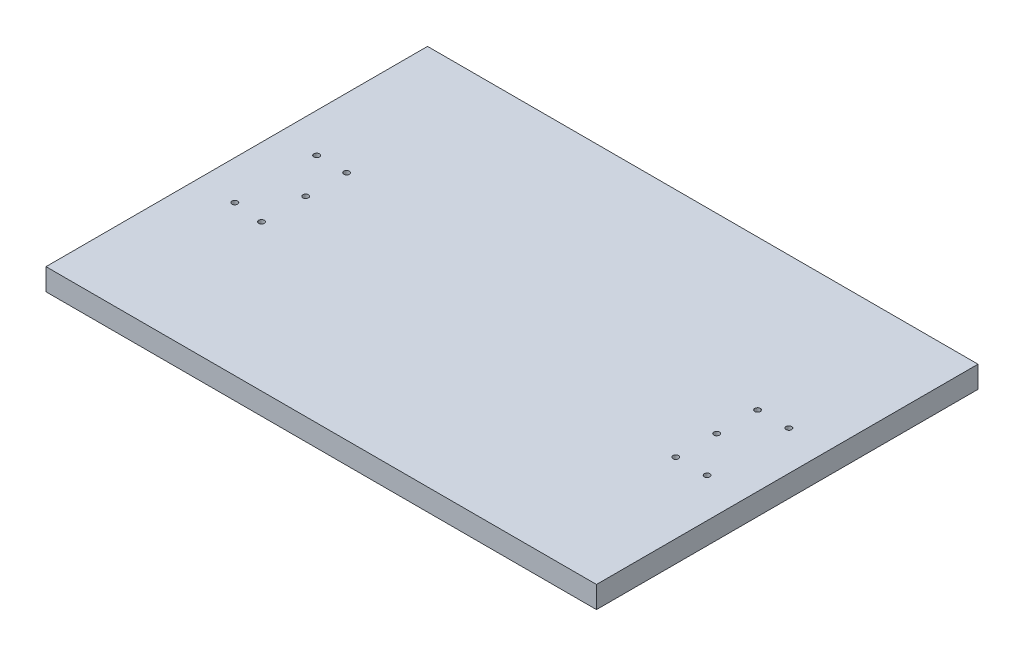
ISO-10303-21;
HEADER;
FILE_DESCRIPTION(('STEP AP214'),'2;1');
FILE_NAME('part.step','',(''),(''),'','','');
FILE_SCHEMA(('AUTOMOTIVE_DESIGN { 1 0 10303 214 1 1 1 1 }'));
ENDSEC;
DATA;
#1=APPLICATION_CONTEXT('core data for automotive mechanical design processes');
#2=APPLICATION_PROTOCOL_DEFINITION('international standard','automotive_design',2000,#1);
#3=PRODUCT_CONTEXT('',#1,'mechanical');
#4=PRODUCT('Part','Part','',(#3));
#5=PRODUCT_RELATED_PRODUCT_CATEGORY('part','',(#4));
#6=PRODUCT_DEFINITION_FORMATION('','',#4);
#7=PRODUCT_DEFINITION_CONTEXT('part definition',#1,'design');
#8=PRODUCT_DEFINITION('design','',#6,#7);
#9=PRODUCT_DEFINITION_SHAPE('','',#8);
#10=(LENGTH_UNIT() NAMED_UNIT(*) SI_UNIT(.MILLI.,.METRE.));
#11=(NAMED_UNIT(*) PLANE_ANGLE_UNIT() SI_UNIT($,.RADIAN.));
#12=(NAMED_UNIT(*) SI_UNIT($,.STERADIAN.) SOLID_ANGLE_UNIT());
#13=UNCERTAINTY_MEASURE_WITH_UNIT(LENGTH_MEASURE(1.E-05),#10,'distance_accuracy_value','');
#14=(GEOMETRIC_REPRESENTATION_CONTEXT(3) GLOBAL_UNCERTAINTY_ASSIGNED_CONTEXT((#13)) GLOBAL_UNIT_ASSIGNED_CONTEXT((#10,
#11,#12)) REPRESENTATION_CONTEXT('',''));
#15=CARTESIAN_POINT('',(0.,0.,0.));
#16=DIRECTION('',(0.,0.,1.));
#17=DIRECTION('',(1.,0.,0.));
#18=AXIS2_PLACEMENT_3D('',#15,#16,#17);
#19=CARTESIAN_POINT('',(505.,-20.,-350.));
#20=DIRECTION('',(0.,0.,1.));
#21=DIRECTION('',(1.,0.,0.));
#22=AXIS2_PLACEMENT_3D('',#19,#20,#21);
#23=PLANE('',#22);
#24=DIRECTION('',(0.,1.,0.));
#25=VECTOR('',#24,1.);
#26=CARTESIAN_POINT('',(-505.,-20.,-350.));
#27=LINE('',#26,#25);
#28=CARTESIAN_POINT('',(-505.,-20.,-350.));
#29=VERTEX_POINT('',#28);
#30=CARTESIAN_POINT('',(-505.,20.,-350.));
#31=VERTEX_POINT('',#30);
#32=EDGE_CURVE('E223',#29,#31,#27,.T.);
#33=ORIENTED_EDGE('',*,*,#32,.T.);
#34=DIRECTION('',(-1.,0.,0.));
#35=VECTOR('',#34,1.);
#36=CARTESIAN_POINT('',(505.,20.,-350.));
#37=LINE('',#36,#35);
#38=CARTESIAN_POINT('',(505.,20.,-350.));
#39=VERTEX_POINT('',#38);
#40=EDGE_CURVE('E11',#39,#31,#37,.T.);
#41=ORIENTED_EDGE('',*,*,#40,.F.);
#42=DIRECTION('',(0.,1.,0.));
#43=VECTOR('',#42,1.);
#44=CARTESIAN_POINT('',(505.,-20.,-350.));
#45=LINE('',#44,#43);
#46=CARTESIAN_POINT('',(505.,-20.,-350.));
#47=VERTEX_POINT('',#46);
#48=EDGE_CURVE('E224',#47,#39,#45,.T.);
#49=ORIENTED_EDGE('',*,*,#48,.F.);
#50=DIRECTION('',(-1.,0.,0.));
#51=VECTOR('',#50,1.);
#52=CARTESIAN_POINT('',(505.,-20.,-350.));
#53=LINE('',#52,#51);
#54=EDGE_CURVE('E234',#47,#29,#53,.T.);
#55=ORIENTED_EDGE('',*,*,#54,.T.);
#56=EDGE_LOOP('',(#33,#41,#49,#55));
#57=FACE_BOUND('',#56,.T.);
#58=ADVANCED_FACE('F55',(#57),#23,.F.);
#59=CARTESIAN_POINT('',(505.,20.,350.));
#60=DIRECTION('',(0.,-1.,0.));
#61=DIRECTION('',(0.,0.,-1.));
#62=AXIS2_PLACEMENT_3D('',#59,#60,#61);
#63=PLANE('',#62);
#64=CARTESIAN_POINT('',(-378.499999999998,20.,-75.0520137662989));
#65=DIRECTION('',(0.,1.,0.));
#66=DIRECTION('',(0.,0.,1.));
#67=AXIS2_PLACEMENT_3D('',#64,#65,#66);
#68=CIRCLE('',#67,5.09999999999999);
#69=CARTESIAN_POINT('',(-378.499999999998,20.,-69.9520137662989));
#70=VERTEX_POINT('',#69);
#71=EDGE_CURVE('E146',#70,#70,#68,.T.);
#72=ORIENTED_EDGE('',*,*,#71,.F.);
#73=EDGE_LOOP('',(#72));
#74=FACE_BOUND('',#73,.T.);
#75=CARTESIAN_POINT('',(-433.499999999998,20.,-74.9999999998687));
#76=DIRECTION('',(0.,1.,0.));
#77=DIRECTION('',(0.,0.,1.));
#78=AXIS2_PLACEMENT_3D('',#75,#76,#77);
#79=CIRCLE('',#78,5.09999999999999);
#80=CARTESIAN_POINT('',(-433.499999999998,20.,-69.8999999998688));
#81=VERTEX_POINT('',#80);
#82=EDGE_CURVE('E145',#81,#81,#79,.T.);
#83=ORIENTED_EDGE('',*,*,#82,.F.);
#84=EDGE_LOOP('',(#83));
#85=FACE_BOUND('',#84,.T.);
#86=CARTESIAN_POINT('',(-378.499999999997,20.,81.1309930747455));
#87=DIRECTION('',(0.,1.,0.));
#88=DIRECTION('',(0.,0.,1.));
#89=AXIS2_PLACEMENT_3D('',#86,#87,#88);
#90=CIRCLE('',#89,5.09999999999999);
#91=CARTESIAN_POINT('',(-378.499999999997,20.,86.2309930747455));
#92=VERTEX_POINT('',#91);
#93=EDGE_CURVE('E159',#92,#92,#90,.T.);
#94=ORIENTED_EDGE('',*,*,#93,.F.);
#95=EDGE_LOOP('',(#94));
#96=FACE_BOUND('',#95,.T.);
#97=CARTESIAN_POINT('',(-433.499999999997,20.,75.0000000001313));
#98=DIRECTION('',(0.,1.,0.));
#99=DIRECTION('',(0.,0.,1.));
#100=AXIS2_PLACEMENT_3D('',#97,#98,#99);
#101=CIRCLE('',#100,5.09999999999999);
#102=CARTESIAN_POINT('',(-433.499999999997,20.,80.1000000001312));
#103=VERTEX_POINT('',#102);
#104=EDGE_CURVE('E167',#103,#103,#101,.T.);
#105=ORIENTED_EDGE('',*,*,#104,.F.);
#106=EDGE_LOOP('',(#105));
#107=FACE_BOUND('',#106,.T.);
#108=CARTESIAN_POINT('',(433.000000000002,20.,-74.9999999998748));
#109=DIRECTION('',(0.,1.,0.));
#110=DIRECTION('',(0.,0.,1.));
#111=AXIS2_PLACEMENT_3D('',#108,#109,#110);
#112=CIRCLE('',#111,5.09999999999999);
#113=CARTESIAN_POINT('',(433.000000000002,20.,-69.8999999998748));
#114=VERTEX_POINT('',#113);
#115=EDGE_CURVE('E175',#114,#114,#112,.T.);
#116=ORIENTED_EDGE('',*,*,#115,.F.);
#117=EDGE_LOOP('',(#116));
#118=FACE_BOUND('',#117,.T.);
#119=CARTESIAN_POINT('',(375.500000000002,20.,-74.9999999998742));
#120=DIRECTION('',(0.,1.,0.));
#121=DIRECTION('',(0.,0.,1.));
#122=AXIS2_PLACEMENT_3D('',#119,#120,#121);
#123=CIRCLE('',#122,5.09999999999999);
#124=CARTESIAN_POINT('',(375.500000000002,20.,-69.8999999998742));
#125=VERTEX_POINT('',#124);
#126=EDGE_CURVE('E183',#125,#125,#123,.T.);
#127=ORIENTED_EDGE('',*,*,#126,.F.);
#128=EDGE_LOOP('',(#127));
#129=FACE_BOUND('',#128,.T.);
#130=CARTESIAN_POINT('',(433.000000000003,20.,75.0000000001252));
#131=DIRECTION('',(0.,1.,0.));
#132=DIRECTION('',(0.,0.,1.));
#133=AXIS2_PLACEMENT_3D('',#130,#131,#132);
#134=CIRCLE('',#133,5.09999999999999);
#135=CARTESIAN_POINT('',(433.000000000003,20.,80.1000000001252));
#136=VERTEX_POINT('',#135);
#137=EDGE_CURVE('E191',#136,#136,#134,.T.);
#138=ORIENTED_EDGE('',*,*,#137,.F.);
#139=EDGE_LOOP('',(#138));
#140=FACE_BOUND('',#139,.T.);
#141=CARTESIAN_POINT('',(375.500000000003,20.,75.0000000001258));
#142=DIRECTION('',(0.,1.,0.));
#143=DIRECTION('',(0.,0.,1.));
#144=AXIS2_PLACEMENT_3D('',#141,#142,#143);
#145=CIRCLE('',#144,5.09999999999999);
#146=CARTESIAN_POINT('',(375.500000000003,20.,80.1000000001258));
#147=VERTEX_POINT('',#146);
#148=EDGE_CURVE('E199',#147,#147,#145,.T.);
#149=ORIENTED_EDGE('',*,*,#148,.F.);
#150=EDGE_LOOP('',(#149));
#151=FACE_BOUND('',#150,.T.);
#152=CARTESIAN_POINT('',(375.500000000003,20.,1.25806608447687E-10));
#153=DIRECTION('',(0.,1.,0.));
#154=DIRECTION('',(0.,0.,1.));
#155=AXIS2_PLACEMENT_3D('',#152,#153,#154);
#156=CIRCLE('',#155,5.09999999999999);
#157=CARTESIAN_POINT('',(375.500000000003,20.,5.1000000001258));
#158=VERTEX_POINT('',#157);
#159=EDGE_CURVE('E207',#158,#158,#156,.T.);
#160=ORIENTED_EDGE('',*,*,#159,.F.);
#161=EDGE_LOOP('',(#160));
#162=FACE_BOUND('',#161,.T.);
#163=CARTESIAN_POINT('',(-378.499999999998,20.,1.31060166835473E-10));
#164=DIRECTION('',(0.,1.,0.));
#165=DIRECTION('',(0.,0.,1.));
#166=AXIS2_PLACEMENT_3D('',#163,#164,#165);
#167=CIRCLE('',#166,5.09999999999999);
#168=CARTESIAN_POINT('',(-378.499999999998,20.,5.10000000013105));
#169=VERTEX_POINT('',#168);
#170=EDGE_CURVE('E215',#169,#169,#167,.T.);
#171=ORIENTED_EDGE('',*,*,#170,.F.);
#172=EDGE_LOOP('',(#171));
#173=FACE_BOUND('',#172,.T.);
#174=DIRECTION('',(0.,0.,1.));
#175=VECTOR('',#174,1.);
#176=CARTESIAN_POINT('',(-505.,20.,350.));
#177=LINE('',#176,#175);
#178=CARTESIAN_POINT('',(-505.,20.,350.));
#179=VERTEX_POINT('',#178);
#180=EDGE_CURVE('E238',#31,#179,#177,.T.);
#181=ORIENTED_EDGE('',*,*,#180,.T.);
#182=DIRECTION('',(-1.,0.,0.));
#183=VECTOR('',#182,1.);
#184=CARTESIAN_POINT('',(505.,20.,350.));
#185=LINE('',#184,#183);
#186=CARTESIAN_POINT('',(505.,20.,350.));
#187=VERTEX_POINT('',#186);
#188=EDGE_CURVE('E64',#187,#179,#185,.T.);
#189=ORIENTED_EDGE('',*,*,#188,.F.);
#190=DIRECTION('',(0.,0.,1.));
#191=VECTOR('',#190,1.);
#192=CARTESIAN_POINT('',(505.,20.,350.));
#193=LINE('',#192,#191);
#194=EDGE_CURVE('E103',#39,#187,#193,.T.);
#195=ORIENTED_EDGE('',*,*,#194,.F.);
#196=ORIENTED_EDGE('',*,*,#40,.T.);
#197=EDGE_LOOP('',(#181,#189,#195,#196));
#198=FACE_BOUND('',#197,.T.);
#199=ADVANCED_FACE('F267',(#74,#85,#96,#107,#118,#129,#140,#151,#162,#173,#198),#63,.F.);
#200=CARTESIAN_POINT('',(505.,-20.,350.));
#201=DIRECTION('',(0.,0.,-1.));
#202=DIRECTION('',(-1.,0.,0.));
#203=AXIS2_PLACEMENT_3D('',#200,#201,#202);
#204=PLANE('',#203);
#205=DIRECTION('',(0.,-1.,0.));
#206=VECTOR('',#205,1.);
#207=CARTESIAN_POINT('',(-505.,-20.,350.));
#208=LINE('',#207,#206);
#209=CARTESIAN_POINT('',(-505.,-20.,350.));
#210=VERTEX_POINT('',#209);
#211=EDGE_CURVE('E90',#179,#210,#208,.T.);
#212=ORIENTED_EDGE('',*,*,#211,.T.);
#213=DIRECTION('',(-1.,0.,0.));
#214=VECTOR('',#213,1.);
#215=CARTESIAN_POINT('',(505.,-20.,350.));
#216=LINE('',#215,#214);
#217=CARTESIAN_POINT('',(505.,-20.,350.));
#218=VERTEX_POINT('',#217);
#219=EDGE_CURVE('E247',#218,#210,#216,.T.);
#220=ORIENTED_EDGE('',*,*,#219,.F.);
#221=DIRECTION('',(0.,-1.,0.));
#222=VECTOR('',#221,1.);
#223=CARTESIAN_POINT('',(505.,-20.,350.));
#224=LINE('',#223,#222);
#225=EDGE_CURVE('E229',#187,#218,#224,.T.);
#226=ORIENTED_EDGE('',*,*,#225,.F.);
#227=ORIENTED_EDGE('',*,*,#188,.T.);
#228=EDGE_LOOP('',(#212,#220,#226,#227));
#229=FACE_BOUND('',#228,.T.);
#230=ADVANCED_FACE('F251',(#229),#204,.F.);
#231=CARTESIAN_POINT('',(505.,-20.,350.));
#232=DIRECTION('',(0.,1.,0.));
#233=DIRECTION('',(0.,0.,1.));
#234=AXIS2_PLACEMENT_3D('',#231,#232,#233);
#235=PLANE('',#234);
#236=DIRECTION('',(0.,0.,-1.));
#237=VECTOR('',#236,1.);
#238=CARTESIAN_POINT('',(-505.,-20.,350.));
#239=LINE('',#238,#237);
#240=EDGE_CURVE('E96',#210,#29,#239,.T.);
#241=ORIENTED_EDGE('',*,*,#240,.T.);
#242=ORIENTED_EDGE('',*,*,#54,.F.);
#243=DIRECTION('',(0.,0.,-1.));
#244=VECTOR('',#243,1.);
#245=CARTESIAN_POINT('',(505.,-20.,350.));
#246=LINE('',#245,#244);
#247=EDGE_CURVE('E72',#218,#47,#246,.T.);
#248=ORIENTED_EDGE('',*,*,#247,.F.);
#249=ORIENTED_EDGE('',*,*,#219,.T.);
#250=EDGE_LOOP('',(#241,#242,#248,#249));
#251=FACE_BOUND('',#250,.T.);
#252=ADVANCED_FACE('F258',(#251),#235,.F.);
#253=CARTESIAN_POINT('',(505.,0.,0.));
#254=DIRECTION('',(-1.,0.,0.));
#255=DIRECTION('',(0.,0.,1.));
#256=AXIS2_PLACEMENT_3D('',#253,#254,#255);
#257=PLANE('',#256);
#258=ORIENTED_EDGE('',*,*,#48,.T.);
#259=ORIENTED_EDGE('',*,*,#194,.T.);
#260=ORIENTED_EDGE('',*,*,#225,.T.);
#261=ORIENTED_EDGE('',*,*,#247,.T.);
#262=EDGE_LOOP('',(#258,#259,#260,#261));
#263=FACE_BOUND('',#262,.T.);
#264=ADVANCED_FACE('F260',(#263),#257,.F.);
#265=CARTESIAN_POINT('',(-505.,0.,0.));
#266=DIRECTION('',(-1.,0.,0.));
#267=DIRECTION('',(0.,0.,1.));
#268=AXIS2_PLACEMENT_3D('',#265,#266,#267);
#269=PLANE('',#268);
#270=ORIENTED_EDGE('',*,*,#32,.F.);
#271=ORIENTED_EDGE('',*,*,#240,.F.);
#272=ORIENTED_EDGE('',*,*,#211,.F.);
#273=ORIENTED_EDGE('',*,*,#180,.F.);
#274=EDGE_LOOP('',(#270,#271,#272,#273));
#275=FACE_BOUND('',#274,.T.);
#276=ADVANCED_FACE('F254',(#275),#269,.T.);
#277=CARTESIAN_POINT('',(-378.499999999998,-9.25,1.31060166835473E-10));
#278=DIRECTION('',(0.,1.,0.));
#279=DIRECTION('',(0.,0.,1.));
#280=AXIS2_PLACEMENT_3D('',#277,#278,#279);
#281=CONICAL_SURFACE('',#280,5.09999999999999,1.02974425867666);
#282=CARTESIAN_POINT('',(-378.499999999998,-12.3143891570405,1.31060166835473E-10));
#283=VERTEX_POINT('',#282);
#284=VERTEX_LOOP('',#283);
#285=FACE_BOUND('',#284,.T.);
#286=CARTESIAN_POINT('',(-378.499999999998,-9.25,1.31060166835473E-10));
#287=DIRECTION('',(0.,1.,0.));
#288=DIRECTION('',(0.,0.,1.));
#289=AXIS2_PLACEMENT_3D('',#286,#287,#288);
#290=CIRCLE('',#289,5.09999999999999);
#291=CARTESIAN_POINT('',(-378.499999999998,-9.25,5.10000000013105));
#292=VERTEX_POINT('',#291);
#293=EDGE_CURVE('E219',#292,#292,#290,.T.);
#294=ORIENTED_EDGE('',*,*,#293,.T.);
#295=EDGE_LOOP('',(#294));
#296=FACE_BOUND('',#295,.T.);
#297=ADVANCED_FACE('F300',(#285,#296),#281,.F.);
#298=CARTESIAN_POINT('',(-378.499999999998,20.,1.31060166835473E-10));
#299=DIRECTION('',(0.,1.,0.));
#300=DIRECTION('',(0.,0.,1.));
#301=AXIS2_PLACEMENT_3D('',#298,#299,#300);
#302=CYLINDRICAL_SURFACE('',#301,5.09999999999999);
#303=ORIENTED_EDGE('',*,*,#293,.F.);
#304=EDGE_LOOP('',(#303));
#305=FACE_BOUND('',#304,.T.);
#306=ORIENTED_EDGE('',*,*,#170,.T.);
#307=EDGE_LOOP('',(#306));
#308=FACE_BOUND('',#307,.T.);
#309=ADVANCED_FACE('F297',(#305,#308),#302,.F.);
#310=CARTESIAN_POINT('',(375.500000000003,-9.25,1.25806608447687E-10));
#311=DIRECTION('',(0.,1.,0.));
#312=DIRECTION('',(0.,0.,1.));
#313=AXIS2_PLACEMENT_3D('',#310,#311,#312);
#314=CONICAL_SURFACE('',#313,5.09999999999999,1.02974425867666);
#315=CARTESIAN_POINT('',(375.500000000003,-12.3143891570405,1.25806608447687E-10));
#316=VERTEX_POINT('',#315);
#317=VERTEX_LOOP('',#316);
#318=FACE_BOUND('',#317,.T.);
#319=CARTESIAN_POINT('',(375.500000000003,-9.25,1.25806608447687E-10));
#320=DIRECTION('',(0.,1.,0.));
#321=DIRECTION('',(0.,0.,1.));
#322=AXIS2_PLACEMENT_3D('',#319,#320,#321);
#323=CIRCLE('',#322,5.09999999999999);
#324=CARTESIAN_POINT('',(375.500000000003,-9.25,5.1000000001258));
#325=VERTEX_POINT('',#324);
#326=EDGE_CURVE('E211',#325,#325,#323,.T.);
#327=ORIENTED_EDGE('',*,*,#326,.T.);
#328=EDGE_LOOP('',(#327));
#329=FACE_BOUND('',#328,.T.);
#330=ADVANCED_FACE('F299',(#318,#329),#314,.F.);
#331=CARTESIAN_POINT('',(375.500000000003,20.,1.25806608447687E-10));
#332=DIRECTION('',(0.,1.,0.));
#333=DIRECTION('',(0.,0.,1.));
#334=AXIS2_PLACEMENT_3D('',#331,#332,#333);
#335=CYLINDRICAL_SURFACE('',#334,5.09999999999999);
#336=ORIENTED_EDGE('',*,*,#326,.F.);
#337=EDGE_LOOP('',(#336));
#338=FACE_BOUND('',#337,.T.);
#339=ORIENTED_EDGE('',*,*,#159,.T.);
#340=EDGE_LOOP('',(#339));
#341=FACE_BOUND('',#340,.T.);
#342=ADVANCED_FACE('F307',(#338,#341),#335,.F.);
#343=CARTESIAN_POINT('',(375.500000000003,-9.25,75.0000000001258));
#344=DIRECTION('',(0.,1.,0.));
#345=DIRECTION('',(0.,0.,1.));
#346=AXIS2_PLACEMENT_3D('',#343,#344,#345);
#347=CONICAL_SURFACE('',#346,5.09999999999999,1.02974425867666);
#348=CARTESIAN_POINT('',(375.500000000003,-12.3143891570405,75.0000000001258));
#349=VERTEX_POINT('',#348);
#350=VERTEX_LOOP('',#349);
#351=FACE_BOUND('',#350,.T.);
#352=CARTESIAN_POINT('',(375.500000000003,-9.25,75.0000000001258));
#353=DIRECTION('',(0.,1.,0.));
#354=DIRECTION('',(0.,0.,1.));
#355=AXIS2_PLACEMENT_3D('',#352,#353,#354);
#356=CIRCLE('',#355,5.09999999999999);
#357=CARTESIAN_POINT('',(375.500000000003,-9.25,80.1000000001258));
#358=VERTEX_POINT('',#357);
#359=EDGE_CURVE('E203',#358,#358,#356,.T.);
#360=ORIENTED_EDGE('',*,*,#359,.T.);
#361=EDGE_LOOP('',(#360));
#362=FACE_BOUND('',#361,.T.);
#363=ADVANCED_FACE('F358',(#351,#362),#347,.F.);
#364=CARTESIAN_POINT('',(375.500000000003,20.,75.0000000001258));
#365=DIRECTION('',(0.,1.,0.));
#366=DIRECTION('',(0.,0.,1.));
#367=AXIS2_PLACEMENT_3D('',#364,#365,#366);
#368=CYLINDRICAL_SURFACE('',#367,5.09999999999999);
#369=ORIENTED_EDGE('',*,*,#359,.F.);
#370=EDGE_LOOP('',(#369));
#371=FACE_BOUND('',#370,.T.);
#372=ORIENTED_EDGE('',*,*,#148,.T.);
#373=EDGE_LOOP('',(#372));
#374=FACE_BOUND('',#373,.T.);
#375=ADVANCED_FACE('F369',(#371,#374),#368,.F.);
#376=CARTESIAN_POINT('',(433.000000000003,-9.25,75.0000000001252));
#377=DIRECTION('',(0.,1.,0.));
#378=DIRECTION('',(0.,0.,1.));
#379=AXIS2_PLACEMENT_3D('',#376,#377,#378);
#380=CONICAL_SURFACE('',#379,5.09999999999999,1.02974425867666);
#381=CARTESIAN_POINT('',(433.000000000003,-12.3143891570405,75.0000000001252));
#382=VERTEX_POINT('',#381);
#383=VERTEX_LOOP('',#382);
#384=FACE_BOUND('',#383,.T.);
#385=CARTESIAN_POINT('',(433.000000000003,-9.25,75.0000000001252));
#386=DIRECTION('',(0.,1.,0.));
#387=DIRECTION('',(0.,0.,1.));
#388=AXIS2_PLACEMENT_3D('',#385,#386,#387);
#389=CIRCLE('',#388,5.09999999999999);
#390=CARTESIAN_POINT('',(433.000000000003,-9.25,80.1000000001252));
#391=VERTEX_POINT('',#390);
#392=EDGE_CURVE('E195',#391,#391,#389,.T.);
#393=ORIENTED_EDGE('',*,*,#392,.T.);
#394=EDGE_LOOP('',(#393));
#395=FACE_BOUND('',#394,.T.);
#396=ADVANCED_FACE('F379',(#384,#395),#380,.F.);
#397=CARTESIAN_POINT('',(433.000000000003,20.,75.0000000001252));
#398=DIRECTION('',(0.,1.,0.));
#399=DIRECTION('',(0.,0.,1.));
#400=AXIS2_PLACEMENT_3D('',#397,#398,#399);
#401=CYLINDRICAL_SURFACE('',#400,5.09999999999999);
#402=ORIENTED_EDGE('',*,*,#392,.F.);
#403=EDGE_LOOP('',(#402));
#404=FACE_BOUND('',#403,.T.);
#405=ORIENTED_EDGE('',*,*,#137,.T.);
#406=EDGE_LOOP('',(#405));
#407=FACE_BOUND('',#406,.T.);
#408=ADVANCED_FACE('F391',(#404,#407),#401,.F.);
#409=CARTESIAN_POINT('',(375.500000000002,-9.25,-74.9999999998742));
#410=DIRECTION('',(0.,1.,0.));
#411=DIRECTION('',(0.,0.,1.));
#412=AXIS2_PLACEMENT_3D('',#409,#410,#411);
#413=CONICAL_SURFACE('',#412,5.09999999999999,1.02974425867666);
#414=CARTESIAN_POINT('',(375.500000000002,-12.3143891570405,-74.9999999998742));
#415=VERTEX_POINT('',#414);
#416=VERTEX_LOOP('',#415);
#417=FACE_BOUND('',#416,.T.);
#418=CARTESIAN_POINT('',(375.500000000002,-9.25,-74.9999999998742));
#419=DIRECTION('',(0.,1.,0.));
#420=DIRECTION('',(0.,0.,1.));
#421=AXIS2_PLACEMENT_3D('',#418,#419,#420);
#422=CIRCLE('',#421,5.09999999999999);
#423=CARTESIAN_POINT('',(375.500000000002,-9.25,-69.8999999998742));
#424=VERTEX_POINT('',#423);
#425=EDGE_CURVE('E187',#424,#424,#422,.T.);
#426=ORIENTED_EDGE('',*,*,#425,.T.);
#427=EDGE_LOOP('',(#426));
#428=FACE_BOUND('',#427,.T.);
#429=ADVANCED_FACE('F401',(#417,#428),#413,.F.);
#430=CARTESIAN_POINT('',(375.500000000002,20.,-74.9999999998742));
#431=DIRECTION('',(0.,1.,0.));
#432=DIRECTION('',(0.,0.,1.));
#433=AXIS2_PLACEMENT_3D('',#430,#431,#432);
#434=CYLINDRICAL_SURFACE('',#433,5.09999999999999);
#435=ORIENTED_EDGE('',*,*,#425,.F.);
#436=EDGE_LOOP('',(#435));
#437=FACE_BOUND('',#436,.T.);
#438=ORIENTED_EDGE('',*,*,#126,.T.);
#439=EDGE_LOOP('',(#438));
#440=FACE_BOUND('',#439,.T.);
#441=ADVANCED_FACE('F413',(#437,#440),#434,.F.);
#442=CARTESIAN_POINT('',(433.000000000002,-9.25,-74.9999999998748));
#443=DIRECTION('',(0.,1.,0.));
#444=DIRECTION('',(0.,0.,1.));
#445=AXIS2_PLACEMENT_3D('',#442,#443,#444);
#446=CONICAL_SURFACE('',#445,5.09999999999999,1.02974425867666);
#447=CARTESIAN_POINT('',(433.000000000002,-12.3143891570405,-74.9999999998748));
#448=VERTEX_POINT('',#447);
#449=VERTEX_LOOP('',#448);
#450=FACE_BOUND('',#449,.T.);
#451=CARTESIAN_POINT('',(433.000000000002,-9.25,-74.9999999998748));
#452=DIRECTION('',(0.,1.,0.));
#453=DIRECTION('',(0.,0.,1.));
#454=AXIS2_PLACEMENT_3D('',#451,#452,#453);
#455=CIRCLE('',#454,5.09999999999999);
#456=CARTESIAN_POINT('',(433.000000000002,-9.25,-69.8999999998748));
#457=VERTEX_POINT('',#456);
#458=EDGE_CURVE('E179',#457,#457,#455,.T.);
#459=ORIENTED_EDGE('',*,*,#458,.T.);
#460=EDGE_LOOP('',(#459));
#461=FACE_BOUND('',#460,.T.);
#462=ADVANCED_FACE('F423',(#450,#461),#446,.F.);
#463=CARTESIAN_POINT('',(433.000000000002,20.,-74.9999999998748));
#464=DIRECTION('',(0.,1.,0.));
#465=DIRECTION('',(0.,0.,1.));
#466=AXIS2_PLACEMENT_3D('',#463,#464,#465);
#467=CYLINDRICAL_SURFACE('',#466,5.09999999999999);
#468=ORIENTED_EDGE('',*,*,#458,.F.);
#469=EDGE_LOOP('',(#468));
#470=FACE_BOUND('',#469,.T.);
#471=ORIENTED_EDGE('',*,*,#115,.T.);
#472=EDGE_LOOP('',(#471));
#473=FACE_BOUND('',#472,.T.);
#474=ADVANCED_FACE('F435',(#470,#473),#467,.F.);
#475=CARTESIAN_POINT('',(-433.499999999997,-9.25,75.0000000001313));
#476=DIRECTION('',(0.,1.,0.));
#477=DIRECTION('',(0.,0.,1.));
#478=AXIS2_PLACEMENT_3D('',#475,#476,#477);
#479=CONICAL_SURFACE('',#478,5.09999999999999,1.02974425867666);
#480=CARTESIAN_POINT('',(-433.499999999997,-12.3143891570405,75.0000000001313));
#481=VERTEX_POINT('',#480);
#482=VERTEX_LOOP('',#481);
#483=FACE_BOUND('',#482,.T.);
#484=CARTESIAN_POINT('',(-433.499999999997,-9.25,75.0000000001313));
#485=DIRECTION('',(0.,1.,0.));
#486=DIRECTION('',(0.,0.,1.));
#487=AXIS2_PLACEMENT_3D('',#484,#485,#486);
#488=CIRCLE('',#487,5.09999999999999);
#489=CARTESIAN_POINT('',(-433.499999999997,-9.25,80.1000000001312));
#490=VERTEX_POINT('',#489);
#491=EDGE_CURVE('E171',#490,#490,#488,.T.);
#492=ORIENTED_EDGE('',*,*,#491,.T.);
#493=EDGE_LOOP('',(#492));
#494=FACE_BOUND('',#493,.T.);
#495=ADVANCED_FACE('F445',(#483,#494),#479,.F.);
#496=CARTESIAN_POINT('',(-433.499999999997,20.,75.0000000001313));
#497=DIRECTION('',(0.,1.,0.));
#498=DIRECTION('',(0.,0.,1.));
#499=AXIS2_PLACEMENT_3D('',#496,#497,#498);
#500=CYLINDRICAL_SURFACE('',#499,5.09999999999999);
#501=ORIENTED_EDGE('',*,*,#491,.F.);
#502=EDGE_LOOP('',(#501));
#503=FACE_BOUND('',#502,.T.);
#504=ORIENTED_EDGE('',*,*,#104,.T.);
#505=EDGE_LOOP('',(#504));
#506=FACE_BOUND('',#505,.T.);
#507=ADVANCED_FACE('F457',(#503,#506),#500,.F.);
#508=CARTESIAN_POINT('',(-378.499999999997,-9.25,81.1309930747455));
#509=DIRECTION('',(0.,1.,0.));
#510=DIRECTION('',(0.,0.,1.));
#511=AXIS2_PLACEMENT_3D('',#508,#509,#510);
#512=CONICAL_SURFACE('',#511,5.09999999999999,1.02974425867666);
#513=CARTESIAN_POINT('',(-378.499999999997,-12.3143891570405,81.1309930747455));
#514=VERTEX_POINT('',#513);
#515=VERTEX_LOOP('',#514);
#516=FACE_BOUND('',#515,.T.);
#517=CARTESIAN_POINT('',(-378.499999999997,-9.25,81.1309930747455));
#518=DIRECTION('',(0.,1.,0.));
#519=DIRECTION('',(0.,0.,1.));
#520=AXIS2_PLACEMENT_3D('',#517,#518,#519);
#521=CIRCLE('',#520,5.09999999999999);
#522=CARTESIAN_POINT('',(-378.499999999997,-9.25,86.2309930747455));
#523=VERTEX_POINT('',#522);
#524=EDGE_CURVE('E163',#523,#523,#521,.T.);
#525=ORIENTED_EDGE('',*,*,#524,.T.);
#526=EDGE_LOOP('',(#525));
#527=FACE_BOUND('',#526,.T.);
#528=ADVANCED_FACE('F467',(#516,#527),#512,.F.);
#529=CARTESIAN_POINT('',(-378.499999999997,20.,81.1309930747455));
#530=DIRECTION('',(0.,1.,0.));
#531=DIRECTION('',(0.,0.,1.));
#532=AXIS2_PLACEMENT_3D('',#529,#530,#531);
#533=CYLINDRICAL_SURFACE('',#532,5.09999999999999);
#534=ORIENTED_EDGE('',*,*,#524,.F.);
#535=EDGE_LOOP('',(#534));
#536=FACE_BOUND('',#535,.T.);
#537=ORIENTED_EDGE('',*,*,#93,.T.);
#538=EDGE_LOOP('',(#537));
#539=FACE_BOUND('',#538,.T.);
#540=ADVANCED_FACE('F479',(#536,#539),#533,.F.);
#541=CARTESIAN_POINT('',(-433.499999999998,-9.25,-74.9999999998687));
#542=DIRECTION('',(0.,1.,0.));
#543=DIRECTION('',(0.,0.,1.));
#544=AXIS2_PLACEMENT_3D('',#541,#542,#543);
#545=CONICAL_SURFACE('',#544,5.09999999999999,1.02974425867666);
#546=CARTESIAN_POINT('',(-433.499999999998,-12.3143891570405,-74.9999999998687));
#547=VERTEX_POINT('',#546);
#548=VERTEX_LOOP('',#547);
#549=FACE_BOUND('',#548,.T.);
#550=CARTESIAN_POINT('',(-433.499999999998,-9.25,-74.9999999998687));
#551=DIRECTION('',(0.,1.,0.));
#552=DIRECTION('',(0.,0.,1.));
#553=AXIS2_PLACEMENT_3D('',#550,#551,#552);
#554=CIRCLE('',#553,5.09999999999999);
#555=CARTESIAN_POINT('',(-433.499999999998,-9.25,-69.8999999998688));
#556=VERTEX_POINT('',#555);
#557=EDGE_CURVE('E151',#556,#556,#554,.T.);
#558=ORIENTED_EDGE('',*,*,#557,.T.);
#559=EDGE_LOOP('',(#558));
#560=FACE_BOUND('',#559,.T.);
#561=ADVANCED_FACE('F489',(#549,#560),#545,.F.);
#562=CARTESIAN_POINT('',(-433.499999999998,20.,-74.9999999998687));
#563=DIRECTION('',(0.,1.,0.));
#564=DIRECTION('',(0.,0.,1.));
#565=AXIS2_PLACEMENT_3D('',#562,#563,#564);
#566=CYLINDRICAL_SURFACE('',#565,5.09999999999999);
#567=ORIENTED_EDGE('',*,*,#557,.F.);
#568=EDGE_LOOP('',(#567));
#569=FACE_BOUND('',#568,.T.);
#570=ORIENTED_EDGE('',*,*,#82,.T.);
#571=EDGE_LOOP('',(#570));
#572=FACE_BOUND('',#571,.T.);
#573=ADVANCED_FACE('F138',(#569,#572),#566,.F.);
#574=CARTESIAN_POINT('',(-378.499999999998,-9.25,-75.0520137662989));
#575=DIRECTION('',(0.,1.,0.));
#576=DIRECTION('',(0.,0.,1.));
#577=AXIS2_PLACEMENT_3D('',#574,#575,#576);
#578=CONICAL_SURFACE('',#577,5.09999999999999,1.02974425867666);
#579=CARTESIAN_POINT('',(-378.499999999998,-12.3143891570405,-75.0520137662989));
#580=VERTEX_POINT('',#579);
#581=VERTEX_LOOP('',#580);
#582=FACE_BOUND('',#581,.T.);
#583=CARTESIAN_POINT('',(-378.499999999998,-9.25,-75.0520137662989));
#584=DIRECTION('',(0.,1.,0.));
#585=DIRECTION('',(0.,0.,1.));
#586=AXIS2_PLACEMENT_3D('',#583,#584,#585);
#587=CIRCLE('',#586,5.09999999999999);
#588=CARTESIAN_POINT('',(-378.499999999998,-9.25,-69.9520137662989));
#589=VERTEX_POINT('',#588);
#590=EDGE_CURVE('E142',#589,#589,#587,.T.);
#591=ORIENTED_EDGE('',*,*,#590,.T.);
#592=EDGE_LOOP('',(#591));
#593=FACE_BOUND('',#592,.T.);
#594=ADVANCED_FACE('F134',(#582,#593),#578,.F.);
#595=CARTESIAN_POINT('',(-378.499999999998,20.,-75.0520137662989));
#596=DIRECTION('',(0.,1.,0.));
#597=DIRECTION('',(0.,0.,1.));
#598=AXIS2_PLACEMENT_3D('',#595,#596,#597);
#599=CYLINDRICAL_SURFACE('',#598,5.09999999999999);
#600=ORIENTED_EDGE('',*,*,#590,.F.);
#601=EDGE_LOOP('',(#600));
#602=FACE_BOUND('',#601,.T.);
#603=ORIENTED_EDGE('',*,*,#71,.T.);
#604=EDGE_LOOP('',(#603));
#605=FACE_BOUND('',#604,.T.);
#606=ADVANCED_FACE('F137',(#602,#605),#599,.F.);
#607=CLOSED_SHELL('',(#58,#199,#230,#252,#264,#276,#297,#309,#330,#342,#363,#375,#396,#408,#429,
#441,#462,#474,#495,#507,#528,#540,#561,#573,#594,#606));
#608=MANIFOLD_SOLID_BREP('B2',#607);
#609=ADVANCED_BREP_SHAPE_REPRESENTATION('',(#18,#608),#14);
#610=SHAPE_DEFINITION_REPRESENTATION(#9,#609);
ENDSEC;
END-ISO-10303-21;
